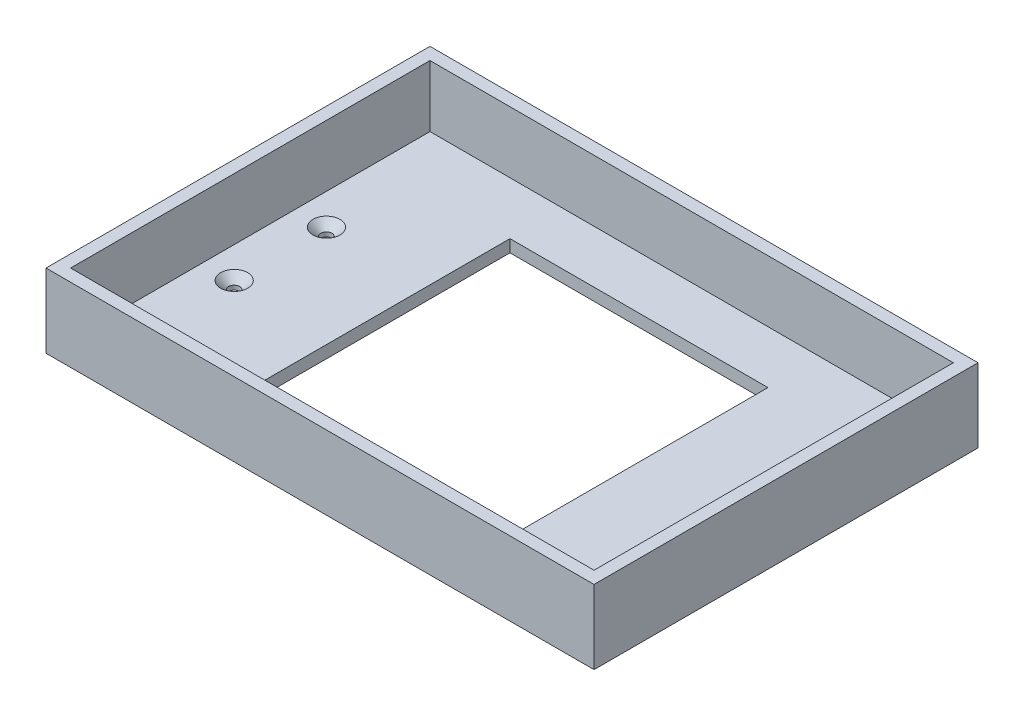
ISO-10303-21;
HEADER;
FILE_DESCRIPTION(('STEP AP214'),'2;1');
FILE_NAME('part.step','',(''),(''),'','','');
FILE_SCHEMA(('AUTOMOTIVE_DESIGN { 1 0 10303 214 1 1 1 1 }'));
ENDSEC;
DATA;
#1=APPLICATION_CONTEXT('core data for automotive mechanical design processes');
#2=APPLICATION_PROTOCOL_DEFINITION('international standard','automotive_design',2000,#1);
#3=PRODUCT_CONTEXT('',#1,'mechanical');
#4=PRODUCT('Part','Part','',(#3));
#5=PRODUCT_RELATED_PRODUCT_CATEGORY('part','',(#4));
#6=PRODUCT_DEFINITION_FORMATION('','',#4);
#7=PRODUCT_DEFINITION_CONTEXT('part definition',#1,'design');
#8=PRODUCT_DEFINITION('design','',#6,#7);
#9=PRODUCT_DEFINITION_SHAPE('','',#8);
#10=(LENGTH_UNIT() NAMED_UNIT(*) SI_UNIT(.MILLI.,.METRE.));
#11=(NAMED_UNIT(*) PLANE_ANGLE_UNIT() SI_UNIT($,.RADIAN.));
#12=(NAMED_UNIT(*) SI_UNIT($,.STERADIAN.) SOLID_ANGLE_UNIT());
#13=UNCERTAINTY_MEASURE_WITH_UNIT(LENGTH_MEASURE(1.E-05),#10,'distance_accuracy_value','');
#14=(GEOMETRIC_REPRESENTATION_CONTEXT(3) GLOBAL_UNCERTAINTY_ASSIGNED_CONTEXT((#13)) GLOBAL_UNIT_ASSIGNED_CONTEXT((#10,
#11,#12)) REPRESENTATION_CONTEXT('',''));
#15=CARTESIAN_POINT('',(0.,0.,0.));
#16=DIRECTION('',(0.,0.,1.));
#17=DIRECTION('',(1.,0.,0.));
#18=AXIS2_PLACEMENT_3D('',#15,#16,#17);
#19=CARTESIAN_POINT('',(-44.545,-2.,0.));
#20=DIRECTION('',(1.,0.,0.));
#21=DIRECTION('',(0.,0.,-1.));
#22=AXIS2_PLACEMENT_3D('',#19,#20,#21);
#23=PLANE('',#22);
#24=DIRECTION('',(0.,1.,0.));
#25=VECTOR('',#24,1.);
#26=CARTESIAN_POINT('',(-44.545,-2.,31.21));
#27=LINE('',#26,#25);
#28=CARTESIAN_POINT('',(-44.545,-2.,31.21));
#29=VERTEX_POINT('',#28);
#30=CARTESIAN_POINT('',(-44.545,10.,31.21));
#31=VERTEX_POINT('',#30);
#32=EDGE_CURVE('E238',#29,#31,#27,.T.);
#33=ORIENTED_EDGE('',*,*,#32,.T.);
#34=DIRECTION('',(0.,0.,1.));
#35=VECTOR('',#34,1.);
#36=CARTESIAN_POINT('',(-44.545,10.,31.21));
#37=LINE('',#36,#35);
#38=CARTESIAN_POINT('',(-44.545,10.,-31.21));
#39=VERTEX_POINT('',#38);
#40=EDGE_CURVE('E225',#39,#31,#37,.T.);
#41=ORIENTED_EDGE('',*,*,#40,.F.);
#42=DIRECTION('',(0.,1.,0.));
#43=VECTOR('',#42,1.);
#44=CARTESIAN_POINT('',(-44.545,-2.,-31.21));
#45=LINE('',#44,#43);
#46=CARTESIAN_POINT('',(-44.545,-2.,-31.21));
#47=VERTEX_POINT('',#46);
#48=EDGE_CURVE('E11',#47,#39,#45,.T.);
#49=ORIENTED_EDGE('',*,*,#48,.F.);
#50=DIRECTION('',(0.,0.,-1.));
#51=VECTOR('',#50,1.);
#52=CARTESIAN_POINT('',(-44.545,-2.,0.));
#53=LINE('',#52,#51);
#54=EDGE_CURVE('E228',#29,#47,#53,.T.);
#55=ORIENTED_EDGE('',*,*,#54,.F.);
#56=EDGE_LOOP('',(#33,#41,#49,#55));
#57=FACE_BOUND('',#56,.T.);
#58=ADVANCED_FACE('F34',(#57),#23,.F.);
#59=CARTESIAN_POINT('',(0.,-2.,-31.21));
#60=DIRECTION('',(0.,0.,1.));
#61=DIRECTION('',(1.,0.,0.));
#62=AXIS2_PLACEMENT_3D('',#59,#60,#61);
#63=PLANE('',#62);
#64=ORIENTED_EDGE('',*,*,#48,.T.);
#65=DIRECTION('',(-1.,0.,0.));
#66=VECTOR('',#65,1.);
#67=CARTESIAN_POINT('',(-44.545,10.,-31.21));
#68=LINE('',#67,#66);
#69=CARTESIAN_POINT('',(44.545,10.,-31.21));
#70=VERTEX_POINT('',#69);
#71=EDGE_CURVE('E222',#70,#39,#68,.T.);
#72=ORIENTED_EDGE('',*,*,#71,.F.);
#73=DIRECTION('',(0.,1.,0.));
#74=VECTOR('',#73,1.);
#75=CARTESIAN_POINT('',(44.545,-2.,-31.21));
#76=LINE('',#75,#74);
#77=CARTESIAN_POINT('',(44.545,-2.,-31.21));
#78=VERTEX_POINT('',#77);
#79=EDGE_CURVE('E42',#78,#70,#76,.T.);
#80=ORIENTED_EDGE('',*,*,#79,.F.);
#81=DIRECTION('',(1.,0.,0.));
#82=VECTOR('',#81,1.);
#83=CARTESIAN_POINT('',(0.,-2.,-31.21));
#84=LINE('',#83,#82);
#85=EDGE_CURVE('E237',#47,#78,#84,.T.);
#86=ORIENTED_EDGE('',*,*,#85,.F.);
#87=EDGE_LOOP('',(#64,#72,#80,#86));
#88=FACE_BOUND('',#87,.T.);
#89=ADVANCED_FACE('F270',(#88),#63,.F.);
#90=CARTESIAN_POINT('',(44.545,-2.,0.));
#91=DIRECTION('',(1.,0.,0.));
#92=DIRECTION('',(0.,0.,-1.));
#93=AXIS2_PLACEMENT_3D('',#90,#91,#92);
#94=PLANE('',#93);
#95=ORIENTED_EDGE('',*,*,#79,.T.);
#96=DIRECTION('',(0.,0.,-1.));
#97=VECTOR('',#96,1.);
#98=CARTESIAN_POINT('',(44.545,10.,31.21));
#99=LINE('',#98,#97);
#100=CARTESIAN_POINT('',(44.545,10.,31.21));
#101=VERTEX_POINT('',#100);
#102=EDGE_CURVE('E219',#101,#70,#99,.T.);
#103=ORIENTED_EDGE('',*,*,#102,.F.);
#104=DIRECTION('',(0.,1.,0.));
#105=VECTOR('',#104,1.);
#106=CARTESIAN_POINT('',(44.545,-2.,31.21));
#107=LINE('',#106,#105);
#108=CARTESIAN_POINT('',(44.545,-2.,31.21));
#109=VERTEX_POINT('',#108);
#110=EDGE_CURVE('E241',#109,#101,#107,.T.);
#111=ORIENTED_EDGE('',*,*,#110,.F.);
#112=DIRECTION('',(0.,0.,-1.));
#113=VECTOR('',#112,1.);
#114=CARTESIAN_POINT('',(44.545,-2.,0.));
#115=LINE('',#114,#113);
#116=EDGE_CURVE('E234',#109,#78,#115,.T.);
#117=ORIENTED_EDGE('',*,*,#116,.T.);
#118=EDGE_LOOP('',(#95,#103,#111,#117));
#119=FACE_BOUND('',#118,.T.);
#120=ADVANCED_FACE('F275',(#119),#94,.T.);
#121=CARTESIAN_POINT('',(0.,-2.,31.21));
#122=DIRECTION('',(0.,0.,1.));
#123=DIRECTION('',(1.,0.,0.));
#124=AXIS2_PLACEMENT_3D('',#121,#122,#123);
#125=PLANE('',#124);
#126=ORIENTED_EDGE('',*,*,#110,.T.);
#127=DIRECTION('',(1.,0.,0.));
#128=VECTOR('',#127,1.);
#129=CARTESIAN_POINT('',(-44.545,10.,31.21));
#130=LINE('',#129,#128);
#131=EDGE_CURVE('E216',#31,#101,#130,.T.);
#132=ORIENTED_EDGE('',*,*,#131,.F.);
#133=ORIENTED_EDGE('',*,*,#32,.F.);
#134=DIRECTION('',(1.,0.,0.));
#135=VECTOR('',#134,1.);
#136=CARTESIAN_POINT('',(0.,-2.,31.21));
#137=LINE('',#136,#135);
#138=EDGE_CURVE('E231',#29,#109,#137,.T.);
#139=ORIENTED_EDGE('',*,*,#138,.T.);
#140=EDGE_LOOP('',(#126,#132,#133,#139));
#141=FACE_BOUND('',#140,.T.);
#142=ADVANCED_FACE('F288',(#141),#125,.T.);
#143=CARTESIAN_POINT('',(0.,-2.,0.));
#144=DIRECTION('',(0.,1.,0.));
#145=DIRECTION('',(0.,0.,1.));
#146=AXIS2_PLACEMENT_3D('',#143,#144,#145);
#147=PLANE('',#146);
#148=DIRECTION('',(1.,0.,0.));
#149=VECTOR('',#148,1.);
#150=CARTESIAN_POINT('',(0.,-2.,20.6397148624546));
#151=LINE('',#150,#149);
#152=CARTESIAN_POINT('',(-20.9675803435516,-2.,20.6397148624546));
#153=VERTEX_POINT('',#152);
#154=CARTESIAN_POINT('',(20.9675803435516,-2.,20.6397148624546));
#155=VERTEX_POINT('',#154);
#156=EDGE_CURVE('E154',#153,#155,#151,.T.);
#157=ORIENTED_EDGE('',*,*,#156,.T.);
#158=DIRECTION('',(0.,0.,-1.));
#159=VECTOR('',#158,1.);
#160=CARTESIAN_POINT('',(20.9675803435516,-2.,0.));
#161=LINE('',#160,#159);
#162=CARTESIAN_POINT('',(20.9675803435516,-2.,-20.6397148624546));
#163=VERTEX_POINT('',#162);
#164=EDGE_CURVE('E157',#155,#163,#161,.T.);
#165=ORIENTED_EDGE('',*,*,#164,.T.);
#166=DIRECTION('',(-1.,0.,0.));
#167=VECTOR('',#166,1.);
#168=CARTESIAN_POINT('',(0.,-2.,-20.6397148624546));
#169=LINE('',#168,#167);
#170=CARTESIAN_POINT('',(-20.9675803435516,-2.,-20.6397148624546));
#171=VERTEX_POINT('',#170);
#172=EDGE_CURVE('E149',#163,#171,#169,.T.);
#173=ORIENTED_EDGE('',*,*,#172,.T.);
#174=DIRECTION('',(0.,0.,1.));
#175=VECTOR('',#174,1.);
#176=CARTESIAN_POINT('',(-20.9675803435516,-2.,0.));
#177=LINE('',#176,#175);
#178=EDGE_CURVE('E129',#171,#153,#177,.T.);
#179=ORIENTED_EDGE('',*,*,#178,.T.);
#180=EDGE_LOOP('',(#157,#165,#173,#179));
#181=FACE_BOUND('',#180,.T.);
#182=CARTESIAN_POINT('',(-37.5,-2.,-7.33550144696772));
#183=DIRECTION('',(0.,1.,0.));
#184=DIRECTION('',(0.,0.,1.));
#185=AXIS2_PLACEMENT_3D('',#182,#183,#184);
#186=CIRCLE('',#185,0.899999999999995);
#187=CARTESIAN_POINT('',(-37.5,-2.,-6.43550144696773));
#188=VERTEX_POINT('',#187);
#189=EDGE_CURVE('E37',#188,#188,#186,.T.);
#190=ORIENTED_EDGE('',*,*,#189,.T.);
#191=EDGE_LOOP('',(#190));
#192=FACE_BOUND('',#191,.T.);
#193=CARTESIAN_POINT('',(-37.5,-2.,7.66449855303228));
#194=DIRECTION('',(0.,1.,0.));
#195=DIRECTION('',(0.,0.,1.));
#196=AXIS2_PLACEMENT_3D('',#193,#194,#195);
#197=CIRCLE('',#196,0.899999999999995);
#198=CARTESIAN_POINT('',(-37.5,-2.,8.56449855303227));
#199=VERTEX_POINT('',#198);
#200=EDGE_CURVE('E172',#199,#199,#197,.T.);
#201=ORIENTED_EDGE('',*,*,#200,.T.);
#202=EDGE_LOOP('',(#201));
#203=FACE_BOUND('',#202,.T.);
#204=CARTESIAN_POINT('',(37.5,-2.,7.66449855303228));
#205=DIRECTION('',(0.,1.,0.));
#206=DIRECTION('',(0.,0.,1.));
#207=AXIS2_PLACEMENT_3D('',#204,#205,#206);
#208=CIRCLE('',#207,0.899999999999995);
#209=CARTESIAN_POINT('',(37.5,-2.,8.56449855303227));
#210=VERTEX_POINT('',#209);
#211=EDGE_CURVE('E179',#210,#210,#208,.T.);
#212=ORIENTED_EDGE('',*,*,#211,.T.);
#213=EDGE_LOOP('',(#212));
#214=FACE_BOUND('',#213,.T.);
#215=CARTESIAN_POINT('',(37.5,-2.,-7.33550144696772));
#216=DIRECTION('',(0.,1.,0.));
#217=DIRECTION('',(0.,0.,1.));
#218=AXIS2_PLACEMENT_3D('',#215,#216,#217);
#219=CIRCLE('',#218,0.899999999999995);
#220=CARTESIAN_POINT('',(37.5,-2.,-6.43550144696773));
#221=VERTEX_POINT('',#220);
#222=EDGE_CURVE('E186',#221,#221,#219,.T.);
#223=ORIENTED_EDGE('',*,*,#222,.T.);
#224=EDGE_LOOP('',(#223));
#225=FACE_BOUND('',#224,.T.);
#226=ORIENTED_EDGE('',*,*,#54,.T.);
#227=ORIENTED_EDGE('',*,*,#85,.T.);
#228=ORIENTED_EDGE('',*,*,#116,.F.);
#229=ORIENTED_EDGE('',*,*,#138,.F.);
#230=EDGE_LOOP('',(#226,#227,#228,#229));
#231=FACE_BOUND('',#230,.T.);
#232=ADVANCED_FACE('F250',(#181,#192,#203,#214,#225,#231),#147,.F.);
#233=CARTESIAN_POINT('',(0.,10.,0.));
#234=DIRECTION('',(0.,1.,0.));
#235=DIRECTION('',(0.,0.,1.));
#236=AXIS2_PLACEMENT_3D('',#233,#234,#235);
#237=PLANE('',#236);
#238=ORIENTED_EDGE('',*,*,#131,.T.);
#239=ORIENTED_EDGE('',*,*,#102,.T.);
#240=ORIENTED_EDGE('',*,*,#71,.T.);
#241=ORIENTED_EDGE('',*,*,#40,.T.);
#242=EDGE_LOOP('',(#238,#239,#240,#241));
#243=FACE_BOUND('',#242,.T.);
#244=DIRECTION('',(-1.,0.,0.));
#245=VECTOR('',#244,1.);
#246=CARTESIAN_POINT('',(-42.545,10.,-29.21));
#247=LINE('',#246,#245);
#248=CARTESIAN_POINT('',(42.545,10.,-29.21));
#249=VERTEX_POINT('',#248);
#250=CARTESIAN_POINT('',(-42.545,10.,-29.21));
#251=VERTEX_POINT('',#250);
#252=EDGE_CURVE('E189',#249,#251,#247,.T.);
#253=ORIENTED_EDGE('',*,*,#252,.F.);
#254=DIRECTION('',(0.,0.,-1.));
#255=VECTOR('',#254,1.);
#256=CARTESIAN_POINT('',(42.545,10.,29.21));
#257=LINE('',#256,#255);
#258=CARTESIAN_POINT('',(42.545,10.,29.21));
#259=VERTEX_POINT('',#258);
#260=EDGE_CURVE('E187',#259,#249,#257,.T.);
#261=ORIENTED_EDGE('',*,*,#260,.F.);
#262=DIRECTION('',(1.,0.,0.));
#263=VECTOR('',#262,1.);
#264=CARTESIAN_POINT('',(-42.545,10.,29.21));
#265=LINE('',#264,#263);
#266=CARTESIAN_POINT('',(-42.545,10.,29.21));
#267=VERTEX_POINT('',#266);
#268=EDGE_CURVE('E195',#267,#259,#265,.T.);
#269=ORIENTED_EDGE('',*,*,#268,.F.);
#270=DIRECTION('',(0.,0.,1.));
#271=VECTOR('',#270,1.);
#272=CARTESIAN_POINT('',(-42.545,10.,29.21));
#273=LINE('',#272,#271);
#274=EDGE_CURVE('E192',#251,#267,#273,.T.);
#275=ORIENTED_EDGE('',*,*,#274,.F.);
#276=EDGE_LOOP('',(#253,#261,#269,#275));
#277=FACE_BOUND('',#276,.T.);
#278=ADVANCED_FACE('F285',(#243,#277),#237,.T.);
#279=CARTESIAN_POINT('',(42.545,10.,29.21));
#280=DIRECTION('',(-1.,0.,0.));
#281=DIRECTION('',(0.,0.,1.));
#282=AXIS2_PLACEMENT_3D('',#279,#280,#281);
#283=PLANE('',#282);
#284=DIRECTION('',(0.,0.,-1.));
#285=VECTOR('',#284,1.);
#286=CARTESIAN_POINT('',(42.545,0.,29.21));
#287=LINE('',#286,#285);
#288=CARTESIAN_POINT('',(42.545,0.,29.21));
#289=VERTEX_POINT('',#288);
#290=CARTESIAN_POINT('',(42.545,0.,-29.21));
#291=VERTEX_POINT('',#290);
#292=EDGE_CURVE('E198',#289,#291,#287,.T.);
#293=ORIENTED_EDGE('',*,*,#292,.F.);
#294=DIRECTION('',(0.,-1.,0.));
#295=VECTOR('',#294,1.);
#296=CARTESIAN_POINT('',(42.545,10.,29.21));
#297=LINE('',#296,#295);
#298=EDGE_CURVE('E197',#259,#289,#297,.T.);
#299=ORIENTED_EDGE('',*,*,#298,.F.);
#300=ORIENTED_EDGE('',*,*,#260,.T.);
#301=DIRECTION('',(0.,-1.,0.));
#302=VECTOR('',#301,1.);
#303=CARTESIAN_POINT('',(42.545,10.,-29.21));
#304=LINE('',#303,#302);
#305=EDGE_CURVE('E213',#249,#291,#304,.T.);
#306=ORIENTED_EDGE('',*,*,#305,.T.);
#307=EDGE_LOOP('',(#293,#299,#300,#306));
#308=FACE_BOUND('',#307,.T.);
#309=ADVANCED_FACE('F301',(#308),#283,.T.);
#310=CARTESIAN_POINT('',(-42.545,10.,-29.21));
#311=DIRECTION('',(0.,0.,1.));
#312=DIRECTION('',(1.,0.,0.));
#313=AXIS2_PLACEMENT_3D('',#310,#311,#312);
#314=PLANE('',#313);
#315=DIRECTION('',(-1.,0.,0.));
#316=VECTOR('',#315,1.);
#317=CARTESIAN_POINT('',(-42.545,0.,-29.21));
#318=LINE('',#317,#316);
#319=CARTESIAN_POINT('',(-42.545,0.,-29.21));
#320=VERTEX_POINT('',#319);
#321=EDGE_CURVE('E200',#291,#320,#318,.T.);
#322=ORIENTED_EDGE('',*,*,#321,.F.);
#323=ORIENTED_EDGE('',*,*,#305,.F.);
#324=ORIENTED_EDGE('',*,*,#252,.T.);
#325=DIRECTION('',(0.,-1.,0.));
#326=VECTOR('',#325,1.);
#327=CARTESIAN_POINT('',(-42.545,10.,-29.21));
#328=LINE('',#327,#326);
#329=EDGE_CURVE('E210',#251,#320,#328,.T.);
#330=ORIENTED_EDGE('',*,*,#329,.T.);
#331=EDGE_LOOP('',(#322,#323,#324,#330));
#332=FACE_BOUND('',#331,.T.);
#333=ADVANCED_FACE('F335',(#332),#314,.T.);
#334=CARTESIAN_POINT('',(-42.545,10.,29.21));
#335=DIRECTION('',(1.,0.,0.));
#336=DIRECTION('',(0.,0.,-1.));
#337=AXIS2_PLACEMENT_3D('',#334,#335,#336);
#338=PLANE('',#337);
#339=DIRECTION('',(0.,0.,1.));
#340=VECTOR('',#339,1.);
#341=CARTESIAN_POINT('',(-42.545,0.,29.21));
#342=LINE('',#341,#340);
#343=CARTESIAN_POINT('',(-42.545,0.,29.21));
#344=VERTEX_POINT('',#343);
#345=EDGE_CURVE('E202',#320,#344,#342,.T.);
#346=ORIENTED_EDGE('',*,*,#345,.F.);
#347=ORIENTED_EDGE('',*,*,#329,.F.);
#348=ORIENTED_EDGE('',*,*,#274,.T.);
#349=DIRECTION('',(0.,-1.,0.));
#350=VECTOR('',#349,1.);
#351=CARTESIAN_POINT('',(-42.545,10.,29.21));
#352=LINE('',#351,#350);
#353=EDGE_CURVE('E207',#267,#344,#352,.T.);
#354=ORIENTED_EDGE('',*,*,#353,.T.);
#355=EDGE_LOOP('',(#346,#347,#348,#354));
#356=FACE_BOUND('',#355,.T.);
#357=ADVANCED_FACE('F344',(#356),#338,.T.);
#358=CARTESIAN_POINT('',(-42.545,10.,29.21));
#359=DIRECTION('',(0.,0.,-1.));
#360=DIRECTION('',(-1.,0.,0.));
#361=AXIS2_PLACEMENT_3D('',#358,#359,#360);
#362=PLANE('',#361);
#363=DIRECTION('',(1.,0.,0.));
#364=VECTOR('',#363,1.);
#365=CARTESIAN_POINT('',(-42.545,0.,29.21));
#366=LINE('',#365,#364);
#367=EDGE_CURVE('E190',#344,#289,#366,.T.);
#368=ORIENTED_EDGE('',*,*,#367,.F.);
#369=ORIENTED_EDGE('',*,*,#353,.F.);
#370=ORIENTED_EDGE('',*,*,#268,.T.);
#371=ORIENTED_EDGE('',*,*,#298,.T.);
#372=EDGE_LOOP('',(#368,#369,#370,#371));
#373=FACE_BOUND('',#372,.T.);
#374=ADVANCED_FACE('F308',(#373),#362,.T.);
#375=CARTESIAN_POINT('',(0.,0.,0.));
#376=DIRECTION('',(0.,1.,0.));
#377=DIRECTION('',(0.,0.,1.));
#378=AXIS2_PLACEMENT_3D('',#375,#376,#377);
#379=PLANE('',#378);
#380=DIRECTION('',(0.,0.,-1.));
#381=VECTOR('',#380,1.);
#382=CARTESIAN_POINT('',(20.9675803435516,0.,20.6397148624546));
#383=LINE('',#382,#381);
#384=CARTESIAN_POINT('',(20.9675803435516,0.,20.6397148624546));
#385=VERTEX_POINT('',#384);
#386=CARTESIAN_POINT('',(20.9675803435516,0.,-20.6397148624546));
#387=VERTEX_POINT('',#386);
#388=EDGE_CURVE('E58',#385,#387,#383,.T.);
#389=ORIENTED_EDGE('',*,*,#388,.F.);
#390=DIRECTION('',(1.,0.,0.));
#391=VECTOR('',#390,1.);
#392=CARTESIAN_POINT('',(-20.9675803435516,0.,20.6397148624546));
#393=LINE('',#392,#391);
#394=CARTESIAN_POINT('',(-20.9675803435516,0.,20.6397148624546));
#395=VERTEX_POINT('',#394);
#396=EDGE_CURVE('E142',#395,#385,#393,.T.);
#397=ORIENTED_EDGE('',*,*,#396,.F.);
#398=DIRECTION('',(0.,0.,1.));
#399=VECTOR('',#398,1.);
#400=CARTESIAN_POINT('',(-20.9675803435516,0.,20.6397148624546));
#401=LINE('',#400,#399);
#402=CARTESIAN_POINT('',(-20.9675803435516,0.,-20.6397148624546));
#403=VERTEX_POINT('',#402);
#404=EDGE_CURVE('E126',#403,#395,#401,.T.);
#405=ORIENTED_EDGE('',*,*,#404,.F.);
#406=DIRECTION('',(-1.,0.,0.));
#407=VECTOR('',#406,1.);
#408=CARTESIAN_POINT('',(-20.9675803435516,0.,-20.6397148624546));
#409=LINE('',#408,#407);
#410=EDGE_CURVE('E135',#387,#403,#409,.T.);
#411=ORIENTED_EDGE('',*,*,#410,.F.);
#412=EDGE_LOOP('',(#389,#397,#405,#411));
#413=FACE_BOUND('',#412,.T.);
#414=CARTESIAN_POINT('',(-37.5,0.,-7.33550144696772));
#415=DIRECTION('',(0.,1.,0.));
#416=DIRECTION('',(0.,0.,1.));
#417=AXIS2_PLACEMENT_3D('',#414,#415,#416);
#418=CIRCLE('',#417,2.2);
#419=CARTESIAN_POINT('',(-37.5,0.,-5.13550144696772));
#420=VERTEX_POINT('',#419);
#421=EDGE_CURVE('E160',#420,#420,#418,.T.);
#422=ORIENTED_EDGE('',*,*,#421,.F.);
#423=EDGE_LOOP('',(#422));
#424=FACE_BOUND('',#423,.T.);
#425=CARTESIAN_POINT('',(-37.5,0.,7.66449855303228));
#426=DIRECTION('',(0.,1.,0.));
#427=DIRECTION('',(0.,0.,1.));
#428=AXIS2_PLACEMENT_3D('',#425,#426,#427);
#429=CIRCLE('',#428,2.2);
#430=CARTESIAN_POINT('',(-37.5,0.,9.86449855303228));
#431=VERTEX_POINT('',#430);
#432=EDGE_CURVE('E166',#431,#431,#429,.T.);
#433=ORIENTED_EDGE('',*,*,#432,.F.);
#434=EDGE_LOOP('',(#433));
#435=FACE_BOUND('',#434,.T.);
#436=CARTESIAN_POINT('',(37.5,0.,7.66449855303228));
#437=DIRECTION('',(0.,1.,0.));
#438=DIRECTION('',(0.,0.,1.));
#439=AXIS2_PLACEMENT_3D('',#436,#437,#438);
#440=CIRCLE('',#439,2.2);
#441=CARTESIAN_POINT('',(37.5,0.,9.86449855303228));
#442=VERTEX_POINT('',#441);
#443=EDGE_CURVE('E173',#442,#442,#440,.T.);
#444=ORIENTED_EDGE('',*,*,#443,.F.);
#445=EDGE_LOOP('',(#444));
#446=FACE_BOUND('',#445,.T.);
#447=CARTESIAN_POINT('',(37.5,0.,-7.33550144696772));
#448=DIRECTION('',(0.,1.,0.));
#449=DIRECTION('',(0.,0.,1.));
#450=AXIS2_PLACEMENT_3D('',#447,#448,#449);
#451=CIRCLE('',#450,2.2);
#452=CARTESIAN_POINT('',(37.5,0.,-5.13550144696772));
#453=VERTEX_POINT('',#452);
#454=EDGE_CURVE('E180',#453,#453,#451,.T.);
#455=ORIENTED_EDGE('',*,*,#454,.F.);
#456=EDGE_LOOP('',(#455));
#457=FACE_BOUND('',#456,.T.);
#458=ORIENTED_EDGE('',*,*,#292,.T.);
#459=ORIENTED_EDGE('',*,*,#321,.T.);
#460=ORIENTED_EDGE('',*,*,#345,.T.);
#461=ORIENTED_EDGE('',*,*,#367,.T.);
#462=EDGE_LOOP('',(#458,#459,#460,#461));
#463=FACE_BOUND('',#462,.T.);
#464=ADVANCED_FACE('F139',(#413,#424,#435,#446,#457,#463),#379,.T.);
#465=CARTESIAN_POINT('',(37.5,0.,-7.33550144696772));
#466=DIRECTION('',(0.,1.,0.));
#467=DIRECTION('',(0.,0.,1.));
#468=AXIS2_PLACEMENT_3D('',#465,#466,#467);
#469=CYLINDRICAL_SURFACE('',#468,0.899999999999995);
#470=CARTESIAN_POINT('',(37.5,-1.30000000000001,-7.33550144696772));
#471=DIRECTION('',(0.,1.,0.));
#472=DIRECTION('',(0.,0.,1.));
#473=AXIS2_PLACEMENT_3D('',#470,#471,#472);
#474=CIRCLE('',#473,0.899999999999991);
#475=CARTESIAN_POINT('',(37.5,-1.30000000000001,-6.43550144696773));
#476=VERTEX_POINT('',#475);
#477=EDGE_CURVE('E183',#476,#476,#474,.T.);
#478=ORIENTED_EDGE('',*,*,#477,.T.);
#479=EDGE_LOOP('',(#478));
#480=FACE_BOUND('',#479,.T.);
#481=ORIENTED_EDGE('',*,*,#222,.F.);
#482=EDGE_LOOP('',(#481));
#483=FACE_BOUND('',#482,.T.);
#484=ADVANCED_FACE('F307',(#480,#483),#469,.F.);
#485=CARTESIAN_POINT('',(37.5,0.,-7.33550144696772));
#486=DIRECTION('',(0.,1.,0.));
#487=DIRECTION('',(0.,0.,1.));
#488=AXIS2_PLACEMENT_3D('',#485,#486,#487);
#489=CONICAL_SURFACE('',#488,2.2,0.785398163397448);
#490=ORIENTED_EDGE('',*,*,#477,.F.);
#491=EDGE_LOOP('',(#490));
#492=FACE_BOUND('',#491,.T.);
#493=ORIENTED_EDGE('',*,*,#454,.T.);
#494=EDGE_LOOP('',(#493));
#495=FACE_BOUND('',#494,.T.);
#496=ADVANCED_FACE('F372',(#492,#495),#489,.F.);
#497=CARTESIAN_POINT('',(37.5,0.,7.66449855303228));
#498=DIRECTION('',(0.,1.,0.));
#499=DIRECTION('',(0.,0.,1.));
#500=AXIS2_PLACEMENT_3D('',#497,#498,#499);
#501=CYLINDRICAL_SURFACE('',#500,0.899999999999995);
#502=CARTESIAN_POINT('',(37.5,-1.30000000000001,7.66449855303228));
#503=DIRECTION('',(0.,1.,0.));
#504=DIRECTION('',(0.,0.,1.));
#505=AXIS2_PLACEMENT_3D('',#502,#503,#504);
#506=CIRCLE('',#505,0.899999999999991);
#507=CARTESIAN_POINT('',(37.5,-1.30000000000001,8.56449855303227));
#508=VERTEX_POINT('',#507);
#509=EDGE_CURVE('E176',#508,#508,#506,.T.);
#510=ORIENTED_EDGE('',*,*,#509,.T.);
#511=EDGE_LOOP('',(#510));
#512=FACE_BOUND('',#511,.T.);
#513=ORIENTED_EDGE('',*,*,#211,.F.);
#514=EDGE_LOOP('',(#513));
#515=FACE_BOUND('',#514,.T.);
#516=ADVANCED_FACE('F266',(#512,#515),#501,.F.);
#517=CARTESIAN_POINT('',(37.5,0.,7.66449855303228));
#518=DIRECTION('',(0.,1.,0.));
#519=DIRECTION('',(0.,0.,1.));
#520=AXIS2_PLACEMENT_3D('',#517,#518,#519);
#521=CONICAL_SURFACE('',#520,2.2,0.785398163397448);
#522=ORIENTED_EDGE('',*,*,#509,.F.);
#523=EDGE_LOOP('',(#522));
#524=FACE_BOUND('',#523,.T.);
#525=ORIENTED_EDGE('',*,*,#443,.T.);
#526=EDGE_LOOP('',(#525));
#527=FACE_BOUND('',#526,.T.);
#528=ADVANCED_FACE('F256',(#524,#527),#521,.F.);
#529=CARTESIAN_POINT('',(-37.5,0.,7.66449855303228));
#530=DIRECTION('',(0.,1.,0.));
#531=DIRECTION('',(0.,0.,1.));
#532=AXIS2_PLACEMENT_3D('',#529,#530,#531);
#533=CYLINDRICAL_SURFACE('',#532,0.899999999999995);
#534=CARTESIAN_POINT('',(-37.5,-1.30000000000001,7.66449855303228));
#535=DIRECTION('',(0.,1.,0.));
#536=DIRECTION('',(0.,0.,1.));
#537=AXIS2_PLACEMENT_3D('',#534,#535,#536);
#538=CIRCLE('',#537,0.899999999999991);
#539=CARTESIAN_POINT('',(-37.5,-1.30000000000001,8.56449855303227));
#540=VERTEX_POINT('',#539);
#541=EDGE_CURVE('E169',#540,#540,#538,.T.);
#542=ORIENTED_EDGE('',*,*,#541,.T.);
#543=EDGE_LOOP('',(#542));
#544=FACE_BOUND('',#543,.T.);
#545=ORIENTED_EDGE('',*,*,#200,.F.);
#546=EDGE_LOOP('',(#545));
#547=FACE_BOUND('',#546,.T.);
#548=ADVANCED_FACE('F253',(#544,#547),#533,.F.);
#549=CARTESIAN_POINT('',(-37.5,0.,7.66449855303228));
#550=DIRECTION('',(0.,1.,0.));
#551=DIRECTION('',(0.,0.,1.));
#552=AXIS2_PLACEMENT_3D('',#549,#550,#551);
#553=CONICAL_SURFACE('',#552,2.2,0.785398163397448);
#554=ORIENTED_EDGE('',*,*,#541,.F.);
#555=EDGE_LOOP('',(#554));
#556=FACE_BOUND('',#555,.T.);
#557=ORIENTED_EDGE('',*,*,#432,.T.);
#558=EDGE_LOOP('',(#557));
#559=FACE_BOUND('',#558,.T.);
#560=ADVANCED_FACE('F255',(#556,#559),#553,.F.);
#561=CARTESIAN_POINT('',(-37.5,0.,-7.33550144696772));
#562=DIRECTION('',(0.,1.,0.));
#563=DIRECTION('',(0.,0.,1.));
#564=AXIS2_PLACEMENT_3D('',#561,#562,#563);
#565=CYLINDRICAL_SURFACE('',#564,0.899999999999995);
#566=CARTESIAN_POINT('',(-37.5,-1.30000000000001,-7.33550144696772));
#567=DIRECTION('',(0.,1.,0.));
#568=DIRECTION('',(0.,0.,1.));
#569=AXIS2_PLACEMENT_3D('',#566,#567,#568);
#570=CIRCLE('',#569,0.899999999999991);
#571=CARTESIAN_POINT('',(-37.5,-1.30000000000001,-6.43550144696773));
#572=VERTEX_POINT('',#571);
#573=EDGE_CURVE('E163',#572,#572,#570,.T.);
#574=ORIENTED_EDGE('',*,*,#573,.T.);
#575=EDGE_LOOP('',(#574));
#576=FACE_BOUND('',#575,.T.);
#577=ORIENTED_EDGE('',*,*,#189,.F.);
#578=EDGE_LOOP('',(#577));
#579=FACE_BOUND('',#578,.T.);
#580=ADVANCED_FACE('F263',(#576,#579),#565,.F.);
#581=CARTESIAN_POINT('',(-37.5,0.,-7.33550144696772));
#582=DIRECTION('',(0.,1.,0.));
#583=DIRECTION('',(0.,0.,1.));
#584=AXIS2_PLACEMENT_3D('',#581,#582,#583);
#585=CONICAL_SURFACE('',#584,2.2,0.785398163397448);
#586=ORIENTED_EDGE('',*,*,#573,.F.);
#587=EDGE_LOOP('',(#586));
#588=FACE_BOUND('',#587,.T.);
#589=ORIENTED_EDGE('',*,*,#421,.T.);
#590=EDGE_LOOP('',(#589));
#591=FACE_BOUND('',#590,.T.);
#592=ADVANCED_FACE('F416',(#588,#591),#585,.F.);
#593=CARTESIAN_POINT('',(20.9675803435516,-2.54,20.6397148624546));
#594=DIRECTION('',(1.,0.,0.));
#595=DIRECTION('',(0.,0.,-1.));
#596=AXIS2_PLACEMENT_3D('',#593,#594,#595);
#597=PLANE('',#596);
#598=DIRECTION('',(0.,1.,0.));
#599=VECTOR('',#598,1.);
#600=CARTESIAN_POINT('',(20.9675803435516,-2.54,20.6397148624546));
#601=LINE('',#600,#599);
#602=EDGE_CURVE('E147',#155,#385,#601,.T.);
#603=ORIENTED_EDGE('',*,*,#602,.T.);
#604=ORIENTED_EDGE('',*,*,#388,.T.);
#605=DIRECTION('',(0.,1.,0.));
#606=VECTOR('',#605,1.);
#607=CARTESIAN_POINT('',(20.9675803435516,-2.54,-20.6397148624546));
#608=LINE('',#607,#606);
#609=EDGE_CURVE('E132',#163,#387,#608,.T.);
#610=ORIENTED_EDGE('',*,*,#609,.F.);
#611=ORIENTED_EDGE('',*,*,#164,.F.);
#612=EDGE_LOOP('',(#603,#604,#610,#611));
#613=FACE_BOUND('',#612,.T.);
#614=ADVANCED_FACE('F425',(#613),#597,.F.);
#615=CARTESIAN_POINT('',(-20.9675803435516,-2.54,20.6397148624546));
#616=DIRECTION('',(0.,0.,1.));
#617=DIRECTION('',(1.,0.,0.));
#618=AXIS2_PLACEMENT_3D('',#615,#616,#617);
#619=PLANE('',#618);
#620=DIRECTION('',(0.,1.,0.));
#621=VECTOR('',#620,1.);
#622=CARTESIAN_POINT('',(-20.9675803435516,-2.54,20.6397148624546));
#623=LINE('',#622,#621);
#624=EDGE_CURVE('E131',#153,#395,#623,.T.);
#625=ORIENTED_EDGE('',*,*,#624,.T.);
#626=ORIENTED_EDGE('',*,*,#396,.T.);
#627=ORIENTED_EDGE('',*,*,#602,.F.);
#628=ORIENTED_EDGE('',*,*,#156,.F.);
#629=EDGE_LOOP('',(#625,#626,#627,#628));
#630=FACE_BOUND('',#629,.T.);
#631=ADVANCED_FACE('F447',(#630),#619,.F.);
#632=CARTESIAN_POINT('',(-20.9675803435516,-2.54,20.6397148624546));
#633=DIRECTION('',(-1.,0.,0.));
#634=DIRECTION('',(0.,0.,1.));
#635=AXIS2_PLACEMENT_3D('',#632,#633,#634);
#636=PLANE('',#635);
#637=DIRECTION('',(0.,1.,0.));
#638=VECTOR('',#637,1.);
#639=CARTESIAN_POINT('',(-20.9675803435516,-2.54,-20.6397148624546));
#640=LINE('',#639,#638);
#641=EDGE_CURVE('E50',#171,#403,#640,.T.);
#642=ORIENTED_EDGE('',*,*,#641,.T.);
#643=ORIENTED_EDGE('',*,*,#404,.T.);
#644=ORIENTED_EDGE('',*,*,#624,.F.);
#645=ORIENTED_EDGE('',*,*,#178,.F.);
#646=EDGE_LOOP('',(#642,#643,#644,#645));
#647=FACE_BOUND('',#646,.T.);
#648=ADVANCED_FACE('F123',(#647),#636,.F.);
#649=CARTESIAN_POINT('',(-20.9675803435516,-2.54,-20.6397148624546));
#650=DIRECTION('',(0.,0.,-1.));
#651=DIRECTION('',(-1.,0.,0.));
#652=AXIS2_PLACEMENT_3D('',#649,#650,#651);
#653=PLANE('',#652);
#654=ORIENTED_EDGE('',*,*,#609,.T.);
#655=ORIENTED_EDGE('',*,*,#410,.T.);
#656=ORIENTED_EDGE('',*,*,#641,.F.);
#657=ORIENTED_EDGE('',*,*,#172,.F.);
#658=EDGE_LOOP('',(#654,#655,#656,#657));
#659=FACE_BOUND('',#658,.T.);
#660=ADVANCED_FACE('F136',(#659),#653,.F.);
#661=CLOSED_SHELL('',(#58,#89,#120,#142,#232,#278,#309,#333,#357,#374,#464,#484,#496,#516,#528,
#548,#560,#580,#592,#614,#631,#648,#660));
#662=MANIFOLD_SOLID_BREP('B2',#661);
#663=ADVANCED_BREP_SHAPE_REPRESENTATION('',(#18,#662),#14);
#664=SHAPE_DEFINITION_REPRESENTATION(#9,#663);
ENDSEC;
END-ISO-10303-21;
